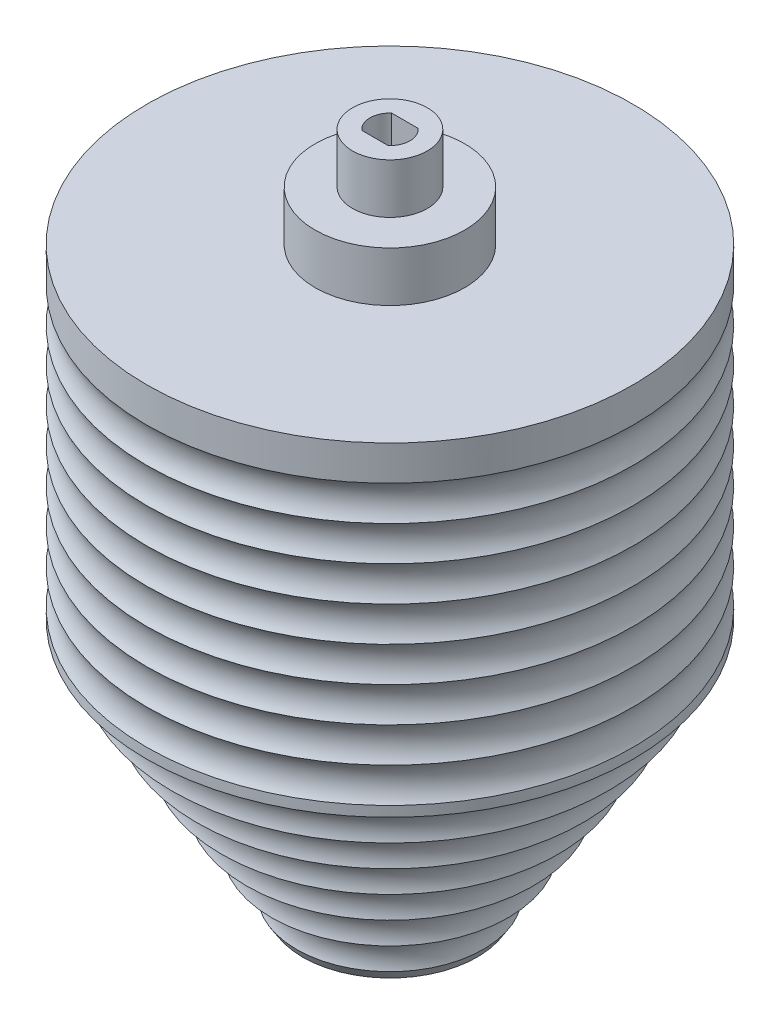
ISO-10303-21;
HEADER;
FILE_DESCRIPTION(('STEP AP214'),'2;1');
FILE_NAME('part.step','',(''),(''),'','','');
FILE_SCHEMA(('AUTOMOTIVE_DESIGN { 1 0 10303 214 1 1 1 1 }'));
ENDSEC;
DATA;
#1=APPLICATION_CONTEXT('core data for automotive mechanical design processes');
#2=APPLICATION_PROTOCOL_DEFINITION('international standard','automotive_design',2000,#1);
#3=PRODUCT_CONTEXT('',#1,'mechanical');
#4=PRODUCT('Part','Part','',(#3));
#5=PRODUCT_RELATED_PRODUCT_CATEGORY('part','',(#4));
#6=PRODUCT_DEFINITION_FORMATION('','',#4);
#7=PRODUCT_DEFINITION_CONTEXT('part definition',#1,'design');
#8=PRODUCT_DEFINITION('design','',#6,#7);
#9=PRODUCT_DEFINITION_SHAPE('','',#8);
#10=(LENGTH_UNIT() NAMED_UNIT(*) SI_UNIT(.MILLI.,.METRE.));
#11=(NAMED_UNIT(*) PLANE_ANGLE_UNIT() SI_UNIT($,.RADIAN.));
#12=(NAMED_UNIT(*) SI_UNIT($,.STERADIAN.) SOLID_ANGLE_UNIT());
#13=UNCERTAINTY_MEASURE_WITH_UNIT(LENGTH_MEASURE(1.E-05),#10,'distance_accuracy_value','');
#14=(GEOMETRIC_REPRESENTATION_CONTEXT(3) GLOBAL_UNCERTAINTY_ASSIGNED_CONTEXT((#13)) GLOBAL_UNIT_ASSIGNED_CONTEXT((#10,
#11,#12)) REPRESENTATION_CONTEXT('',''));
#15=CARTESIAN_POINT('',(0.,0.,0.));
#16=DIRECTION('',(0.,0.,1.));
#17=DIRECTION('',(1.,0.,0.));
#18=AXIS2_PLACEMENT_3D('',#15,#16,#17);
#19=CARTESIAN_POINT('',(0.,45.2294928136093,0.));
#20=DIRECTION('',(0.,1.,0.));
#21=DIRECTION('',(0.,0.,1.));
#22=AXIS2_PLACEMENT_3D('',#19,#20,#21);
#23=PLANE('',#22);
#24=CARTESIAN_POINT('',(0.,45.2294928136093,0.));
#25=DIRECTION('',(0.,1.,0.));
#26=DIRECTION('',(0.,0.,1.));
#27=AXIS2_PLACEMENT_3D('',#24,#25,#26);
#28=CIRCLE('',#27,30.);
#29=CARTESIAN_POINT('',(0.,45.2294928136093,30.));
#30=VERTEX_POINT('',#29);
#31=EDGE_CURVE('E117',#30,#30,#28,.T.);
#32=ORIENTED_EDGE('',*,*,#31,.T.);
#33=EDGE_LOOP('',(#32));
#34=FACE_BOUND('',#33,.T.);
#35=CARTESIAN_POINT('',(0.,45.2294928136093,0.));
#36=DIRECTION('',(0.,1.,0.));
#37=DIRECTION('',(0.,0.,1.));
#38=AXIS2_PLACEMENT_3D('',#35,#36,#37);
#39=CIRCLE('',#38,15.);
#40=CARTESIAN_POINT('',(0.,45.2294928136093,15.));
#41=VERTEX_POINT('',#40);
#42=EDGE_CURVE('E108',#41,#41,#39,.T.);
#43=ORIENTED_EDGE('',*,*,#42,.F.);
#44=EDGE_LOOP('',(#43));
#45=FACE_BOUND('',#44,.T.);
#46=ADVANCED_FACE('F39',(#34,#45),#23,.T.);
#47=CARTESIAN_POINT('',(0.,57.3492996881719,0.));
#48=DIRECTION('',(0.,1.,0.));
#49=DIRECTION('',(0.,0.,1.));
#50=AXIS2_PLACEMENT_3D('',#47,#48,#49);
#51=CYLINDRICAL_SURFACE('',#50,97.5);
#52=CARTESIAN_POINT('',(0.,11.2433603046011,0.));
#53=DIRECTION('',(0.,-1.,0.));
#54=DIRECTION('',(0.,0.,-1.));
#55=AXIS2_PLACEMENT_3D('',#52,#53,#54);
#56=CIRCLE('',#55,97.5);
#57=CARTESIAN_POINT('',(0.,11.2433603046011,-97.5));
#58=VERTEX_POINT('',#57);
#59=EDGE_CURVE('E161',#58,#58,#56,.T.);
#60=ORIENTED_EDGE('',*,*,#59,.F.);
#61=EDGE_LOOP('',(#60));
#62=FACE_BOUND('',#61,.T.);
#63=CARTESIAN_POINT('',(0.,25.2294928136093,0.));
#64=DIRECTION('',(0.,1.,0.));
#65=DIRECTION('',(0.,0.,1.));
#66=AXIS2_PLACEMENT_3D('',#63,#64,#65);
#67=CIRCLE('',#66,97.5);
#68=CARTESIAN_POINT('',(0.,25.2294928136093,97.5));
#69=VERTEX_POINT('',#68);
#70=EDGE_CURVE('E121',#69,#69,#67,.F.);
#71=ORIENTED_EDGE('',*,*,#70,.T.);
#72=EDGE_LOOP('',(#71));
#73=FACE_BOUND('',#72,.T.);
#74=ADVANCED_FACE('F175',(#62,#73),#51,.T.);
#75=CARTESIAN_POINT('',(0.,4.25029405009688,0.));
#76=DIRECTION('',(0.,1.,0.));
#77=DIRECTION('',(0.,0.,1.));
#78=AXIS2_PLACEMENT_3D('',#75,#76,#77);
#79=TOROIDAL_SURFACE('',#78,107.860840909893,12.5);
#80=ORIENTED_EDGE('',*,*,#59,.T.);
#81=EDGE_LOOP('',(#80));
#82=FACE_BOUND('',#81,.T.);
#83=CARTESIAN_POINT('',(0.,-2.7427722044073,0.));
#84=DIRECTION('',(0.,1.,0.));
#85=DIRECTION('',(0.,0.,1.));
#86=AXIS2_PLACEMENT_3D('',#83,#84,#85);
#87=CIRCLE('',#86,97.5);
#88=CARTESIAN_POINT('',(0.,-2.7427722044073,97.5));
#89=VERTEX_POINT('',#88);
#90=EDGE_CURVE('E162',#89,#89,#87,.T.);
#91=ORIENTED_EDGE('',*,*,#90,.T.);
#92=EDGE_LOOP('',(#91));
#93=FACE_BOUND('',#92,.T.);
#94=ADVANCED_FACE('F172',(#82,#93),#79,.F.);
#95=CARTESIAN_POINT('',(0.,-9.73583845891146,0.));
#96=DIRECTION('',(0.,1.,0.));
#97=DIRECTION('',(0.,0.,1.));
#98=AXIS2_PLACEMENT_3D('',#95,#96,#97);
#99=TOROIDAL_SURFACE('',#98,107.860840909893,12.5);
#100=ORIENTED_EDGE('',*,*,#90,.F.);
#101=EDGE_LOOP('',(#100));
#102=FACE_BOUND('',#101,.T.);
#103=CARTESIAN_POINT('',(0.,-16.7289047134156,0.));
#104=DIRECTION('',(0.,-1.,0.));
#105=DIRECTION('',(0.,0.,-1.));
#106=AXIS2_PLACEMENT_3D('',#103,#104,#105);
#107=CIRCLE('',#106,97.5000000000001);
#108=CARTESIAN_POINT('',(0.,-16.7289047134156,-97.5000000000001));
#109=VERTEX_POINT('',#108);
#110=EDGE_CURVE('E158',#109,#109,#107,.T.);
#111=ORIENTED_EDGE('',*,*,#110,.F.);
#112=EDGE_LOOP('',(#111));
#113=FACE_BOUND('',#112,.T.);
#114=ADVANCED_FACE('F436',(#102,#113),#99,.F.);
#115=CARTESIAN_POINT('',(0.,-23.7219709679198,0.));
#116=DIRECTION('',(0.,1.,0.));
#117=DIRECTION('',(0.,0.,1.));
#118=AXIS2_PLACEMENT_3D('',#115,#116,#117);
#119=TOROIDAL_SURFACE('',#118,107.860840909893,12.5);
#120=ORIENTED_EDGE('',*,*,#110,.T.);
#121=EDGE_LOOP('',(#120));
#122=FACE_BOUND('',#121,.T.);
#123=CARTESIAN_POINT('',(0.,-30.715037222424,0.));
#124=DIRECTION('',(0.,1.,0.));
#125=DIRECTION('',(0.,0.,1.));
#126=AXIS2_PLACEMENT_3D('',#123,#124,#125);
#127=CIRCLE('',#126,97.5);
#128=CARTESIAN_POINT('',(0.,-30.715037222424,97.5));
#129=VERTEX_POINT('',#128);
#130=EDGE_CURVE('E165',#129,#129,#127,.T.);
#131=ORIENTED_EDGE('',*,*,#130,.T.);
#132=EDGE_LOOP('',(#131));
#133=FACE_BOUND('',#132,.T.);
#134=ADVANCED_FACE('F426',(#122,#133),#119,.F.);
#135=CARTESIAN_POINT('',(0.,-37.7081034769281,0.));
#136=DIRECTION('',(0.,1.,0.));
#137=DIRECTION('',(0.,0.,1.));
#138=AXIS2_PLACEMENT_3D('',#135,#136,#137);
#139=TOROIDAL_SURFACE('',#138,107.860840909893,12.5);
#140=ORIENTED_EDGE('',*,*,#130,.F.);
#141=EDGE_LOOP('',(#140));
#142=FACE_BOUND('',#141,.T.);
#143=CARTESIAN_POINT('',(0.,-44.7011697314323,0.));
#144=DIRECTION('',(0.,1.,0.));
#145=DIRECTION('',(0.,0.,1.));
#146=AXIS2_PLACEMENT_3D('',#143,#144,#145);
#147=CIRCLE('',#146,97.5);
#148=CARTESIAN_POINT('',(0.,-44.7011697314323,97.5));
#149=VERTEX_POINT('',#148);
#150=EDGE_CURVE('E150',#149,#149,#147,.T.);
#151=ORIENTED_EDGE('',*,*,#150,.T.);
#152=EDGE_LOOP('',(#151));
#153=FACE_BOUND('',#152,.T.);
#154=ADVANCED_FACE('F416',(#142,#153),#139,.F.);
#155=CARTESIAN_POINT('',(0.,-51.6942359859364,0.));
#156=DIRECTION('',(0.,1.,0.));
#157=DIRECTION('',(0.,0.,1.));
#158=AXIS2_PLACEMENT_3D('',#155,#156,#157);
#159=TOROIDAL_SURFACE('',#158,107.860840909893,12.5);
#160=ORIENTED_EDGE('',*,*,#150,.F.);
#161=EDGE_LOOP('',(#160));
#162=FACE_BOUND('',#161,.T.);
#163=CARTESIAN_POINT('',(0.,-58.6873022404406,0.));
#164=DIRECTION('',(0.,1.,0.));
#165=DIRECTION('',(0.,0.,1.));
#166=AXIS2_PLACEMENT_3D('',#163,#164,#165);
#167=CIRCLE('',#166,97.5);
#168=CARTESIAN_POINT('',(0.,-58.6873022404406,97.5));
#169=VERTEX_POINT('',#168);
#170=EDGE_CURVE('E147',#169,#169,#167,.T.);
#171=ORIENTED_EDGE('',*,*,#170,.T.);
#172=EDGE_LOOP('',(#171));
#173=FACE_BOUND('',#172,.T.);
#174=ADVANCED_FACE('F406',(#162,#173),#159,.F.);
#175=CARTESIAN_POINT('',(0.,-65.6803684949447,0.));
#176=DIRECTION('',(0.,1.,0.));
#177=DIRECTION('',(0.,0.,1.));
#178=AXIS2_PLACEMENT_3D('',#175,#176,#177);
#179=TOROIDAL_SURFACE('',#178,107.860840909893,12.5);
#180=ORIENTED_EDGE('',*,*,#170,.F.);
#181=EDGE_LOOP('',(#180));
#182=FACE_BOUND('',#181,.T.);
#183=CARTESIAN_POINT('',(0.,-72.6734347494489,0.));
#184=DIRECTION('',(0.,1.,0.));
#185=DIRECTION('',(0.,0.,1.));
#186=AXIS2_PLACEMENT_3D('',#183,#184,#185);
#187=CIRCLE('',#186,97.5);
#188=CARTESIAN_POINT('',(0.,-72.6734347494489,97.5));
#189=VERTEX_POINT('',#188);
#190=EDGE_CURVE('E146',#189,#189,#187,.T.);
#191=ORIENTED_EDGE('',*,*,#190,.T.);
#192=EDGE_LOOP('',(#191));
#193=FACE_BOUND('',#192,.T.);
#194=ADVANCED_FACE('F389',(#182,#193),#179,.F.);
#195=CARTESIAN_POINT('',(0.,-93.6526335129613,0.));
#196=DIRECTION('',(0.,1.,0.));
#197=DIRECTION('',(0.,0.,1.));
#198=AXIS2_PLACEMENT_3D('',#195,#196,#197);
#199=TOROIDAL_SURFACE('',#198,107.860840909893,12.5);
#200=CARTESIAN_POINT('',(0.,-100.645699767465,0.));
#201=DIRECTION('',(0.,1.,0.));
#202=DIRECTION('',(0.,0.,1.));
#203=AXIS2_PLACEMENT_3D('',#200,#201,#202);
#204=CIRCLE('',#203,97.5);
#205=CARTESIAN_POINT('',(0.,-100.645699767465,97.5));
#206=VERTEX_POINT('',#205);
#207=EDGE_CURVE('E43',#206,#206,#204,.T.);
#208=ORIENTED_EDGE('',*,*,#207,.T.);
#209=EDGE_LOOP('',(#208));
#210=FACE_BOUND('',#209,.T.);
#211=CARTESIAN_POINT('',(0.,-86.6595672584572,0.));
#212=DIRECTION('',(0.,1.,0.));
#213=DIRECTION('',(0.,0.,1.));
#214=AXIS2_PLACEMENT_3D('',#211,#212,#213);
#215=CIRCLE('',#214,97.5);
#216=CARTESIAN_POINT('',(0.,-86.6595672584572,97.5));
#217=VERTEX_POINT('',#216);
#218=EDGE_CURVE('E153',#217,#217,#215,.T.);
#219=ORIENTED_EDGE('',*,*,#218,.F.);
#220=EDGE_LOOP('',(#219));
#221=FACE_BOUND('',#220,.T.);
#222=ADVANCED_FACE('F380',(#210,#221),#199,.F.);
#223=CARTESIAN_POINT('',(0.,-79.666501003953,0.));
#224=DIRECTION('',(0.,1.,0.));
#225=DIRECTION('',(0.,0.,1.));
#226=AXIS2_PLACEMENT_3D('',#223,#224,#225);
#227=TOROIDAL_SURFACE('',#226,107.860840909893,12.5);
#228=ORIENTED_EDGE('',*,*,#190,.F.);
#229=EDGE_LOOP('',(#228));
#230=FACE_BOUND('',#229,.T.);
#231=ORIENTED_EDGE('',*,*,#218,.T.);
#232=EDGE_LOOP('',(#231));
#233=FACE_BOUND('',#232,.T.);
#234=ADVANCED_FACE('F378',(#230,#233),#227,.F.);
#235=ORIENTED_EDGE('',*,*,#207,.F.);
#236=EDGE_LOOP('',(#235));
#237=FACE_BOUND('',#236,.T.);
#238=CARTESIAN_POINT('',(0.,-104.770507186391,0.));
#239=DIRECTION('',(0.,-1.,0.));
#240=DIRECTION('',(0.,0.,-1.));
#241=AXIS2_PLACEMENT_3D('',#238,#239,#240);
#242=CIRCLE('',#241,97.5);
#243=CARTESIAN_POINT('',(0.,-104.770507186391,-97.5));
#244=VERTEX_POINT('',#243);
#245=EDGE_CURVE('E143',#244,#244,#242,.T.);
#246=ORIENTED_EDGE('',*,*,#245,.F.);
#247=EDGE_LOOP('',(#246));
#248=FACE_BOUND('',#247,.T.);
#249=ADVANCED_FACE('F41',(#237,#248),#51,.T.);
#250=CARTESIAN_POINT('',(0.,-117.117992442394,0.));
#251=DIRECTION('',(0.,1.,0.));
#252=DIRECTION('',(0.,0.,1.));
#253=AXIS2_PLACEMENT_3D('',#250,#251,#252);
#254=TOROIDAL_SURFACE('',#253,99.4466915145426,12.5);
#255=ORIENTED_EDGE('',*,*,#245,.T.);
#256=EDGE_LOOP('',(#255));
#257=FACE_BOUND('',#256,.T.);
#258=CARTESIAN_POINT('',(0.,-120.77885315948,0.));
#259=DIRECTION('',(0.,1.,0.));
#260=DIRECTION('',(0.,0.,1.));
#261=AXIS2_PLACEMENT_3D('',#258,#259,#260);
#262=CIRCLE('',#261,87.4947837668191);
#263=CARTESIAN_POINT('',(0.,-120.77885315948,87.4947837668191));
#264=VERTEX_POINT('',#263);
#265=EDGE_CURVE('E137',#264,#264,#262,.T.);
#266=ORIENTED_EDGE('',*,*,#265,.T.);
#267=EDGE_LOOP('',(#266));
#268=FACE_BOUND('',#267,.T.);
#269=ADVANCED_FACE('F359',(#257,#268),#254,.F.);
#270=CARTESIAN_POINT('',(0.,-133.126338415483,0.));
#271=DIRECTION('',(0.,1.,0.));
#272=DIRECTION('',(0.,0.,1.));
#273=AXIS2_PLACEMENT_3D('',#270,#271,#272);
#274=TOROIDAL_SURFACE('',#273,89.4414752813618,12.5);
#275=ORIENTED_EDGE('',*,*,#265,.F.);
#276=EDGE_LOOP('',(#275));
#277=FACE_BOUND('',#276,.T.);
#278=CARTESIAN_POINT('',(0.,-136.787199132569,0.));
#279=DIRECTION('',(0.,1.,0.));
#280=DIRECTION('',(0.,0.,1.));
#281=AXIS2_PLACEMENT_3D('',#278,#279,#280);
#282=CIRCLE('',#281,77.4895675336383);
#283=CARTESIAN_POINT('',(0.,-136.787199132569,77.4895675336383));
#284=VERTEX_POINT('',#283);
#285=EDGE_CURVE('E140',#284,#284,#282,.T.);
#286=ORIENTED_EDGE('',*,*,#285,.T.);
#287=EDGE_LOOP('',(#286));
#288=FACE_BOUND('',#287,.T.);
#289=ADVANCED_FACE('F349',(#277,#288),#274,.F.);
#290=CARTESIAN_POINT('',(0.,-149.134684388572,0.));
#291=DIRECTION('',(0.,1.,0.));
#292=DIRECTION('',(0.,0.,1.));
#293=AXIS2_PLACEMENT_3D('',#290,#291,#292);
#294=TOROIDAL_SURFACE('',#293,79.436259048181,12.5);
#295=ORIENTED_EDGE('',*,*,#285,.F.);
#296=EDGE_LOOP('',(#295));
#297=FACE_BOUND('',#296,.T.);
#298=CARTESIAN_POINT('',(0.,-152.795545105659,0.));
#299=DIRECTION('',(0.,1.,0.));
#300=DIRECTION('',(0.,0.,1.));
#301=AXIS2_PLACEMENT_3D('',#298,#299,#300);
#302=CIRCLE('',#301,67.4843513004574);
#303=CARTESIAN_POINT('',(0.,-152.795545105659,67.4843513004574));
#304=VERTEX_POINT('',#303);
#305=EDGE_CURVE('E131',#304,#304,#302,.T.);
#306=ORIENTED_EDGE('',*,*,#305,.T.);
#307=EDGE_LOOP('',(#306));
#308=FACE_BOUND('',#307,.T.);
#309=ADVANCED_FACE('F339',(#297,#308),#294,.F.);
#310=CARTESIAN_POINT('',(0.,-165.143030361662,0.));
#311=DIRECTION('',(0.,1.,0.));
#312=DIRECTION('',(0.,0.,1.));
#313=AXIS2_PLACEMENT_3D('',#310,#311,#312);
#314=TOROIDAL_SURFACE('',#313,69.4310428150001,12.5);
#315=ORIENTED_EDGE('',*,*,#305,.F.);
#316=EDGE_LOOP('',(#315));
#317=FACE_BOUND('',#316,.T.);
#318=CARTESIAN_POINT('',(0.,-168.803891078748,0.));
#319=DIRECTION('',(0.,1.,0.));
#320=DIRECTION('',(0.,0.,1.));
#321=AXIS2_PLACEMENT_3D('',#318,#319,#320);
#322=CIRCLE('',#321,57.4791350672766);
#323=CARTESIAN_POINT('',(0.,-168.803891078748,57.4791350672766));
#324=VERTEX_POINT('',#323);
#325=EDGE_CURVE('E134',#324,#324,#322,.T.);
#326=ORIENTED_EDGE('',*,*,#325,.T.);
#327=EDGE_LOOP('',(#326));
#328=FACE_BOUND('',#327,.T.);
#329=ADVANCED_FACE('F329',(#317,#328),#314,.F.);
#330=CARTESIAN_POINT('',(0.,-181.151376334751,0.));
#331=DIRECTION('',(0.,1.,0.));
#332=DIRECTION('',(0.,0.,1.));
#333=AXIS2_PLACEMENT_3D('',#330,#331,#332);
#334=TOROIDAL_SURFACE('',#333,59.4258265818192,12.5);
#335=ORIENTED_EDGE('',*,*,#325,.F.);
#336=EDGE_LOOP('',(#335));
#337=FACE_BOUND('',#336,.T.);
#338=CARTESIAN_POINT('',(0.,-184.812237051837,0.));
#339=DIRECTION('',(0.,1.,0.));
#340=DIRECTION('',(0.,0.,1.));
#341=AXIS2_PLACEMENT_3D('',#338,#339,#340);
#342=CIRCLE('',#341,47.4739188340957);
#343=CARTESIAN_POINT('',(0.,-184.812237051837,47.4739188340957));
#344=VERTEX_POINT('',#343);
#345=EDGE_CURVE('E125',#344,#344,#342,.T.);
#346=ORIENTED_EDGE('',*,*,#345,.T.);
#347=EDGE_LOOP('',(#346));
#348=FACE_BOUND('',#347,.T.);
#349=ADVANCED_FACE('F320',(#337,#348),#334,.F.);
#350=CARTESIAN_POINT('',(0.,-197.15972230784,0.));
#351=DIRECTION('',(0.,1.,0.));
#352=DIRECTION('',(0.,0.,1.));
#353=AXIS2_PLACEMENT_3D('',#350,#351,#352);
#354=TOROIDAL_SURFACE('',#353,49.4206103486384,12.5);
#355=CARTESIAN_POINT('',(0.,-200.820583024927,0.));
#356=DIRECTION('',(0.,1.,0.));
#357=DIRECTION('',(0.,0.,1.));
#358=AXIS2_PLACEMENT_3D('',#355,#356,#357);
#359=CIRCLE('',#358,37.4687026009149);
#360=CARTESIAN_POINT('',(0.,-200.820583024927,37.4687026009149));
#361=VERTEX_POINT('',#360);
#362=EDGE_CURVE('E128',#361,#361,#359,.T.);
#363=ORIENTED_EDGE('',*,*,#362,.T.);
#364=EDGE_LOOP('',(#363));
#365=FACE_BOUND('',#364,.T.);
#366=ORIENTED_EDGE('',*,*,#345,.F.);
#367=EDGE_LOOP('',(#366));
#368=FACE_BOUND('',#367,.T.);
#369=ADVANCED_FACE('F316',(#365,#368),#354,.F.);
#370=CARTESIAN_POINT('',(-35.,-204.770507186391,0.));
#371=DIRECTION('',(0.,-1.,0.));
#372=DIRECTION('',(0.,0.,-1.));
#373=AXIS2_PLACEMENT_3D('',#370,#371,#372);
#374=PLANE('',#373);
#375=CARTESIAN_POINT('',(0.,-204.770507186391,0.));
#376=DIRECTION('',(0.,1.,0.));
#377=DIRECTION('',(0.,0.,1.));
#378=AXIS2_PLACEMENT_3D('',#375,#376,#377);
#379=CIRCLE('',#378,35.);
#380=CARTESIAN_POINT('',(0.,-204.770507186391,35.));
#381=VERTEX_POINT('',#380);
#382=EDGE_CURVE('E48',#381,#381,#379,.T.);
#383=ORIENTED_EDGE('',*,*,#382,.F.);
#384=EDGE_LOOP('',(#383));
#385=FACE_BOUND('',#384,.T.);
#386=ADVANCED_FACE('F193',(#385),#374,.T.);
#387=CARTESIAN_POINT('',(0.,-104.770507186391,0.));
#388=DIRECTION('',(0.,1.,0.));
#389=DIRECTION('',(0.,0.,1.));
#390=AXIS2_PLACEMENT_3D('',#387,#388,#389);
#391=CONICAL_SURFACE('',#390,97.5,0.558599315343563);
#392=ORIENTED_EDGE('',*,*,#362,.F.);
#393=EDGE_LOOP('',(#392));
#394=FACE_BOUND('',#393,.T.);
#395=ORIENTED_EDGE('',*,*,#382,.T.);
#396=EDGE_LOOP('',(#395));
#397=FACE_BOUND('',#396,.T.);
#398=ADVANCED_FACE('F183',(#394,#397),#391,.T.);
#399=CARTESIAN_POINT('',(0.,25.2294928136093,0.));
#400=DIRECTION('',(0.,1.,0.));
#401=DIRECTION('',(0.,0.,1.));
#402=AXIS2_PLACEMENT_3D('',#399,#400,#401);
#403=PLANE('',#402);
#404=CARTESIAN_POINT('',(0.,25.2294928136093,0.));
#405=DIRECTION('',(0.,1.,0.));
#406=DIRECTION('',(0.,0.,1.));
#407=AXIS2_PLACEMENT_3D('',#404,#405,#406);
#408=CIRCLE('',#407,30.);
#409=CARTESIAN_POINT('',(0.,25.2294928136093,30.));
#410=VERTEX_POINT('',#409);
#411=EDGE_CURVE('E11',#410,#410,#408,.T.);
#412=ORIENTED_EDGE('',*,*,#411,.F.);
#413=EDGE_LOOP('',(#412));
#414=FACE_BOUND('',#413,.T.);
#415=ORIENTED_EDGE('',*,*,#70,.F.);
#416=EDGE_LOOP('',(#415));
#417=FACE_BOUND('',#416,.T.);
#418=ADVANCED_FACE('F180',(#414,#417),#403,.T.);
#419=CARTESIAN_POINT('',(0.,45.2294928136093,0.));
#420=DIRECTION('',(0.,-1.,0.));
#421=DIRECTION('',(0.,0.,-1.));
#422=AXIS2_PLACEMENT_3D('',#419,#420,#421);
#423=CYLINDRICAL_SURFACE('',#422,30.);
#424=ORIENTED_EDGE('',*,*,#31,.F.);
#425=EDGE_LOOP('',(#424));
#426=FACE_BOUND('',#425,.T.);
#427=ORIENTED_EDGE('',*,*,#411,.T.);
#428=EDGE_LOOP('',(#427));
#429=FACE_BOUND('',#428,.T.);
#430=ADVANCED_FACE('F182',(#426,#429),#423,.T.);
#431=CARTESIAN_POINT('',(0.,65.2294928136093,0.));
#432=DIRECTION('',(0.,1.,0.));
#433=DIRECTION('',(0.,0.,1.));
#434=AXIS2_PLACEMENT_3D('',#431,#432,#433);
#435=PLANE('',#434);
#436=CARTESIAN_POINT('',(0.,65.2294928136093,0.));
#437=DIRECTION('',(0.,1.,0.));
#438=DIRECTION('',(0.,0.,1.));
#439=AXIS2_PLACEMENT_3D('',#436,#437,#438);
#440=CIRCLE('',#439,15.);
#441=CARTESIAN_POINT('',(0.,65.2294928136093,15.));
#442=VERTEX_POINT('',#441);
#443=EDGE_CURVE('E114',#442,#442,#440,.T.);
#444=ORIENTED_EDGE('',*,*,#443,.T.);
#445=EDGE_LOOP('',(#444));
#446=FACE_BOUND('',#445,.T.);
#447=DIRECTION('',(1.,0.,0.));
#448=VECTOR('',#447,1.);
#449=CARTESIAN_POINT('',(5.29150262212918,65.2294928136093,6.));
#450=LINE('',#449,#448);
#451=CARTESIAN_POINT('',(-5.29150262212918,65.2294928136093,6.));
#452=VERTEX_POINT('',#451);
#453=CARTESIAN_POINT('',(5.29150262212918,65.2294928136093,6.));
#454=VERTEX_POINT('',#453);
#455=EDGE_CURVE('E106',#452,#454,#450,.T.);
#456=ORIENTED_EDGE('',*,*,#455,.F.);
#457=CARTESIAN_POINT('',(0.,65.2294928136093,0.));
#458=DIRECTION('',(0.,1.,0.));
#459=DIRECTION('',(0.,0.,1.));
#460=AXIS2_PLACEMENT_3D('',#457,#458,#459);
#461=CIRCLE('',#460,8.);
#462=CARTESIAN_POINT('',(-5.29150262212918,65.2294928136093,-6.));
#463=VERTEX_POINT('',#462);
#464=EDGE_CURVE('E231',#463,#452,#461,.T.);
#465=ORIENTED_EDGE('',*,*,#464,.F.);
#466=DIRECTION('',(-1.,0.,0.));
#467=VECTOR('',#466,1.);
#468=CARTESIAN_POINT('',(-5.29150262212918,65.2294928136093,-6.));
#469=LINE('',#468,#467);
#470=CARTESIAN_POINT('',(5.29150262212918,65.2294928136093,-6.));
#471=VERTEX_POINT('',#470);
#472=EDGE_CURVE('E62',#471,#463,#469,.T.);
#473=ORIENTED_EDGE('',*,*,#472,.F.);
#474=CARTESIAN_POINT('',(0.,65.2294928136093,0.));
#475=DIRECTION('',(0.,1.,0.));
#476=DIRECTION('',(0.,0.,1.));
#477=AXIS2_PLACEMENT_3D('',#474,#475,#476);
#478=CIRCLE('',#477,8.);
#479=EDGE_CURVE('E234',#454,#471,#478,.T.);
#480=ORIENTED_EDGE('',*,*,#479,.F.);
#481=EDGE_LOOP('',(#456,#465,#473,#480));
#482=FACE_BOUND('',#481,.T.);
#483=ADVANCED_FACE('F190',(#446,#482),#435,.T.);
#484=CARTESIAN_POINT('',(0.,65.2294928136093,0.));
#485=DIRECTION('',(0.,-1.,0.));
#486=DIRECTION('',(0.,0.,-1.));
#487=AXIS2_PLACEMENT_3D('',#484,#485,#486);
#488=CYLINDRICAL_SURFACE('',#487,15.);
#489=ORIENTED_EDGE('',*,*,#443,.F.);
#490=EDGE_LOOP('',(#489));
#491=FACE_BOUND('',#490,.T.);
#492=ORIENTED_EDGE('',*,*,#42,.T.);
#493=EDGE_LOOP('',(#492));
#494=FACE_BOUND('',#493,.T.);
#495=ADVANCED_FACE('F204',(#491,#494),#488,.T.);
#496=CARTESIAN_POINT('',(0.,65.2294928136093,0.));
#497=DIRECTION('',(0.,-1.,0.));
#498=DIRECTION('',(0.,0.,-1.));
#499=AXIS2_PLACEMENT_3D('',#496,#497,#498);
#500=CYLINDRICAL_SURFACE('',#499,8.);
#501=DIRECTION('',(0.,-1.,0.));
#502=VECTOR('',#501,1.);
#503=CARTESIAN_POINT('',(-5.29150262212918,65.2294928136093,6.));
#504=LINE('',#503,#502);
#505=CARTESIAN_POINT('',(-5.29150262212918,45.2294928136093,6.));
#506=VERTEX_POINT('',#505);
#507=EDGE_CURVE('E102',#452,#506,#504,.T.);
#508=ORIENTED_EDGE('',*,*,#507,.T.);
#509=CARTESIAN_POINT('',(0.,45.2294928136093,0.));
#510=DIRECTION('',(0.,1.,0.));
#511=DIRECTION('',(0.,0.,1.));
#512=AXIS2_PLACEMENT_3D('',#509,#510,#511);
#513=CIRCLE('',#512,8.);
#514=CARTESIAN_POINT('',(5.29150262212918,45.2294928136093,6.));
#515=VERTEX_POINT('',#514);
#516=EDGE_CURVE('E82',#506,#515,#513,.T.);
#517=ORIENTED_EDGE('',*,*,#516,.T.);
#518=DIRECTION('',(0.,-1.,0.));
#519=VECTOR('',#518,1.);
#520=CARTESIAN_POINT('',(5.29150262212918,65.2294928136093,6.));
#521=LINE('',#520,#519);
#522=EDGE_CURVE('E100',#454,#515,#521,.T.);
#523=ORIENTED_EDGE('',*,*,#522,.F.);
#524=ORIENTED_EDGE('',*,*,#479,.T.);
#525=DIRECTION('',(0.,-1.,0.));
#526=VECTOR('',#525,1.);
#527=CARTESIAN_POINT('',(5.29150262212918,65.2294928136093,-6.));
#528=LINE('',#527,#526);
#529=CARTESIAN_POINT('',(5.29150262212918,45.2294928136093,-6.));
#530=VERTEX_POINT('',#529);
#531=EDGE_CURVE('E56',#471,#530,#528,.T.);
#532=ORIENTED_EDGE('',*,*,#531,.T.);
#533=CARTESIAN_POINT('',(-5.29150262212918,45.2294928136093,-6.));
#534=VERTEX_POINT('',#533);
#535=EDGE_CURVE('E74',#530,#534,#513,.T.);
#536=ORIENTED_EDGE('',*,*,#535,.T.);
#537=DIRECTION('',(0.,-1.,0.));
#538=VECTOR('',#537,1.);
#539=CARTESIAN_POINT('',(-5.29150262212918,65.2294928136093,-6.));
#540=LINE('',#539,#538);
#541=EDGE_CURVE('E110',#463,#534,#540,.T.);
#542=ORIENTED_EDGE('',*,*,#541,.F.);
#543=ORIENTED_EDGE('',*,*,#464,.T.);
#544=EDGE_LOOP('',(#508,#517,#523,#524,#532,#536,#542,#543));
#545=FACE_BOUND('',#544,.T.);
#546=CARTESIAN_POINT('',(0.,42.2294928136093,0.));
#547=DIRECTION('',(0.,1.,0.));
#548=DIRECTION('',(0.,0.,1.));
#549=AXIS2_PLACEMENT_3D('',#546,#547,#548);
#550=CIRCLE('',#549,8.);
#551=CARTESIAN_POINT('',(0.,42.2294928136093,8.));
#552=VERTEX_POINT('',#551);
#553=EDGE_CURVE('E94',#552,#552,#550,.T.);
#554=ORIENTED_EDGE('',*,*,#553,.F.);
#555=EDGE_LOOP('',(#554));
#556=FACE_BOUND('',#555,.T.);
#557=ADVANCED_FACE('F98',(#545,#556),#500,.F.);
#558=CARTESIAN_POINT('',(5.29150262212918,65.2294928136093,6.));
#559=DIRECTION('',(0.,0.,-1.));
#560=DIRECTION('',(-1.,0.,0.));
#561=AXIS2_PLACEMENT_3D('',#558,#559,#560);
#562=PLANE('',#561);
#563=DIRECTION('',(1.,0.,0.));
#564=VECTOR('',#563,1.);
#565=CARTESIAN_POINT('',(5.29150262212918,45.2294928136093,6.));
#566=LINE('',#565,#564);
#567=EDGE_CURVE('E87',#506,#515,#566,.T.);
#568=ORIENTED_EDGE('',*,*,#567,.F.);
#569=ORIENTED_EDGE('',*,*,#507,.F.);
#570=ORIENTED_EDGE('',*,*,#455,.T.);
#571=ORIENTED_EDGE('',*,*,#522,.T.);
#572=EDGE_LOOP('',(#568,#569,#570,#571));
#573=FACE_BOUND('',#572,.T.);
#574=ADVANCED_FACE('F104',(#573),#562,.T.);
#575=CARTESIAN_POINT('',(-5.29150262212918,65.2294928136093,-6.));
#576=DIRECTION('',(0.,0.,1.));
#577=DIRECTION('',(1.,0.,0.));
#578=AXIS2_PLACEMENT_3D('',#575,#576,#577);
#579=PLANE('',#578);
#580=DIRECTION('',(-1.,0.,0.));
#581=VECTOR('',#580,1.);
#582=CARTESIAN_POINT('',(-5.29150262212918,45.2294928136093,-6.));
#583=LINE('',#582,#581);
#584=EDGE_CURVE('E93',#530,#534,#583,.T.);
#585=ORIENTED_EDGE('',*,*,#584,.F.);
#586=ORIENTED_EDGE('',*,*,#531,.F.);
#587=ORIENTED_EDGE('',*,*,#472,.T.);
#588=ORIENTED_EDGE('',*,*,#541,.T.);
#589=EDGE_LOOP('',(#585,#586,#587,#588));
#590=FACE_BOUND('',#589,.T.);
#591=ADVANCED_FACE('F215',(#590),#579,.T.);
#592=CARTESIAN_POINT('',(0.,45.2294928136093,0.));
#593=DIRECTION('',(0.,1.,0.));
#594=DIRECTION('',(0.,0.,1.));
#595=AXIS2_PLACEMENT_3D('',#592,#593,#594);
#596=PLANE('',#595);
#597=ORIENTED_EDGE('',*,*,#567,.T.);
#598=ORIENTED_EDGE('',*,*,#516,.F.);
#599=EDGE_LOOP('',(#597,#598));
#600=FACE_BOUND('',#599,.T.);
#601=ADVANCED_FACE('F88',(#600),#596,.F.);
#602=CARTESIAN_POINT('',(0.,42.2294928136093,0.));
#603=DIRECTION('',(0.,1.,0.));
#604=DIRECTION('',(0.,0.,1.));
#605=AXIS2_PLACEMENT_3D('',#602,#603,#604);
#606=PLANE('',#605);
#607=ORIENTED_EDGE('',*,*,#553,.T.);
#608=EDGE_LOOP('',(#607));
#609=FACE_BOUND('',#608,.T.);
#610=ADVANCED_FACE('F221',(#609),#606,.T.);
#611=ORIENTED_EDGE('',*,*,#584,.T.);
#612=ORIENTED_EDGE('',*,*,#535,.F.);
#613=EDGE_LOOP('',(#611,#612));
#614=FACE_BOUND('',#613,.T.);
#615=ADVANCED_FACE('F218',(#614),#596,.F.);
#616=CLOSED_SHELL('',(#46,#74,#94,#114,#134,#154,#174,#194,#222,#234,#249,#269,#289,#309,#329,
#349,#369,#386,#398,#418,#430,#483,#495,#557,#574,#591,#601,#610,#615));
#617=MANIFOLD_SOLID_BREP('B2',#616);
#618=ADVANCED_BREP_SHAPE_REPRESENTATION('',(#18,#617),#14);
#619=SHAPE_DEFINITION_REPRESENTATION(#9,#618);
ENDSEC;
END-ISO-10303-21;
